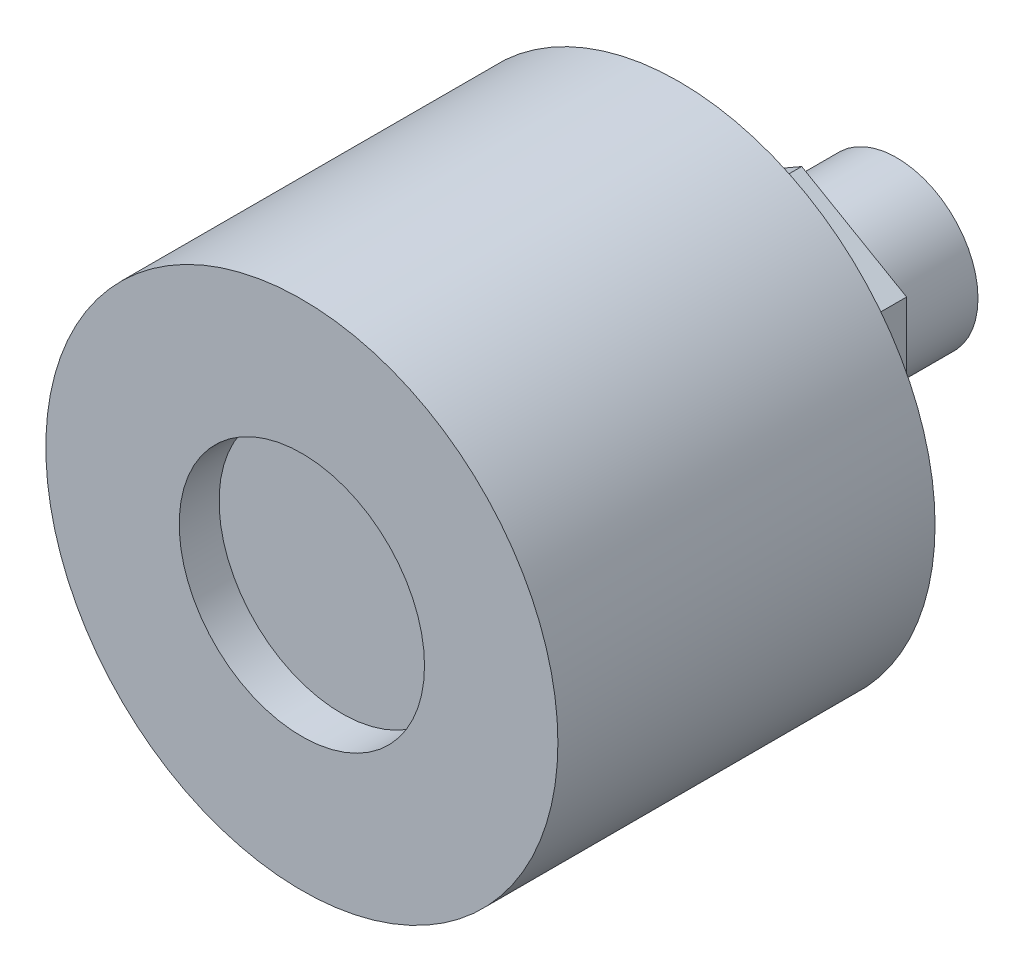
ISO-10303-21;
HEADER;
FILE_DESCRIPTION(('STEP AP214'),'2;1');
FILE_NAME('part.step','',(''),(''),'','','');
FILE_SCHEMA(('AUTOMOTIVE_DESIGN { 1 0 10303 214 1 1 1 1 }'));
ENDSEC;
DATA;
#1=APPLICATION_CONTEXT('core data for automotive mechanical design processes');
#2=APPLICATION_PROTOCOL_DEFINITION('international standard','automotive_design',2000,#1);
#3=PRODUCT_CONTEXT('',#1,'mechanical');
#4=PRODUCT('Part','Part','',(#3));
#5=PRODUCT_RELATED_PRODUCT_CATEGORY('part','',(#4));
#6=PRODUCT_DEFINITION_FORMATION('','',#4);
#7=PRODUCT_DEFINITION_CONTEXT('part definition',#1,'design');
#8=PRODUCT_DEFINITION('design','',#6,#7);
#9=PRODUCT_DEFINITION_SHAPE('','',#8);
#10=(LENGTH_UNIT() NAMED_UNIT(*) SI_UNIT(.MILLI.,.METRE.));
#11=(NAMED_UNIT(*) PLANE_ANGLE_UNIT() SI_UNIT($,.RADIAN.));
#12=(NAMED_UNIT(*) SI_UNIT($,.STERADIAN.) SOLID_ANGLE_UNIT());
#13=UNCERTAINTY_MEASURE_WITH_UNIT(LENGTH_MEASURE(1.E-05),#10,'distance_accuracy_value','');
#14=(GEOMETRIC_REPRESENTATION_CONTEXT(3) GLOBAL_UNCERTAINTY_ASSIGNED_CONTEXT((#13)) GLOBAL_UNIT_ASSIGNED_CONTEXT((#10,
#11,#12)) REPRESENTATION_CONTEXT('',''));
#15=CARTESIAN_POINT('',(0.,0.,0.));
#16=DIRECTION('',(0.,0.,1.));
#17=DIRECTION('',(1.,0.,0.));
#18=AXIS2_PLACEMENT_3D('',#15,#16,#17);
#19=CARTESIAN_POINT('',(0.,0.,-0.3));
#20=DIRECTION('',(0.,0.,1.));
#21=DIRECTION('',(1.,0.,0.));
#22=AXIS2_PLACEMENT_3D('',#19,#20,#21);
#23=CYLINDRICAL_SURFACE('',#22,8.35);
#24=CARTESIAN_POINT('',(0.,0.,1.));
#25=DIRECTION('',(0.,0.,1.));
#26=DIRECTION('',(1.,0.,0.));
#27=AXIS2_PLACEMENT_3D('',#24,#25,#26);
#28=CIRCLE('',#27,8.35);
#29=CARTESIAN_POINT('',(8.35,0.,1.));
#30=VERTEX_POINT('',#29);
#31=EDGE_CURVE('E129',#30,#30,#28,.T.);
#32=ORIENTED_EDGE('',*,*,#31,.F.);
#33=EDGE_LOOP('',(#32));
#34=FACE_BOUND('',#33,.T.);
#35=CARTESIAN_POINT('',(0.,0.,-11.3));
#36=DIRECTION('',(0.,0.,-1.));
#37=DIRECTION('',(-1.,0.,0.));
#38=AXIS2_PLACEMENT_3D('',#35,#36,#37);
#39=CIRCLE('',#38,8.35);
#40=CARTESIAN_POINT('',(-8.35,0.,-11.3));
#41=VERTEX_POINT('',#40);
#42=EDGE_CURVE('E116',#41,#41,#39,.T.);
#43=ORIENTED_EDGE('',*,*,#42,.F.);
#44=EDGE_LOOP('',(#43));
#45=FACE_BOUND('',#44,.T.);
#46=ADVANCED_FACE('F39',(#34,#45),#23,.T.);
#47=CARTESIAN_POINT('',(0.,0.,-0.3));
#48=DIRECTION('',(0.,0.,1.));
#49=DIRECTION('',(1.,0.,0.));
#50=AXIS2_PLACEMENT_3D('',#47,#48,#49);
#51=CYLINDRICAL_SURFACE('',#50,4.);
#52=CARTESIAN_POINT('',(0.,0.,-0.3));
#53=DIRECTION('',(0.,0.,1.));
#54=DIRECTION('',(1.,0.,0.));
#55=AXIS2_PLACEMENT_3D('',#52,#53,#54);
#56=CIRCLE('',#55,4.);
#57=CARTESIAN_POINT('',(4.,0.,-0.3));
#58=VERTEX_POINT('',#57);
#59=EDGE_CURVE('E42',#58,#58,#56,.T.);
#60=ORIENTED_EDGE('',*,*,#59,.F.);
#61=EDGE_LOOP('',(#60));
#62=FACE_BOUND('',#61,.T.);
#63=CARTESIAN_POINT('',(0.,0.,1.));
#64=DIRECTION('',(0.,0.,1.));
#65=DIRECTION('',(1.,0.,0.));
#66=AXIS2_PLACEMENT_3D('',#63,#64,#65);
#67=CIRCLE('',#66,4.);
#68=CARTESIAN_POINT('',(4.,0.,1.));
#69=VERTEX_POINT('',#68);
#70=EDGE_CURVE('E121',#69,#69,#67,.T.);
#71=ORIENTED_EDGE('',*,*,#70,.T.);
#72=EDGE_LOOP('',(#71));
#73=FACE_BOUND('',#72,.T.);
#74=ADVANCED_FACE('F140',(#62,#73),#51,.F.);
#75=CARTESIAN_POINT('',(0.,0.,1.));
#76=DIRECTION('',(0.,0.,1.));
#77=DIRECTION('',(1.,0.,0.));
#78=AXIS2_PLACEMENT_3D('',#75,#76,#77);
#79=PLANE('',#78);
#80=ORIENTED_EDGE('',*,*,#31,.T.);
#81=EDGE_LOOP('',(#80));
#82=FACE_BOUND('',#81,.T.);
#83=ORIENTED_EDGE('',*,*,#70,.F.);
#84=EDGE_LOOP('',(#83));
#85=FACE_BOUND('',#84,.T.);
#86=ADVANCED_FACE('F143',(#82,#85),#79,.T.);
#87=CARTESIAN_POINT('',(0.,0.,-0.3));
#88=DIRECTION('',(0.,0.,-1.));
#89=DIRECTION('',(-1.,0.,0.));
#90=AXIS2_PLACEMENT_3D('',#87,#88,#89);
#91=PLANE('',#90);
#92=ORIENTED_EDGE('',*,*,#59,.T.);
#93=EDGE_LOOP('',(#92));
#94=FACE_BOUND('',#93,.T.);
#95=ADVANCED_FACE('F138',(#94),#91,.F.);
#96=CARTESIAN_POINT('',(0.,0.,-11.3));
#97=DIRECTION('',(0.,0.,-1.));
#98=DIRECTION('',(-1.,0.,0.));
#99=AXIS2_PLACEMENT_3D('',#96,#97,#98);
#100=PLANE('',#99);
#101=DIRECTION('',(0.866025403784442,0.499999999999995,0.));
#102=VECTOR('',#101,1.);
#103=CARTESIAN_POINT('',(-3.42080034494851,1.97500000000004,-11.3));
#104=LINE('',#103,#102);
#105=CARTESIAN_POINT('',(-3.42080034494851,1.97500000000004,-11.3));
#106=VERTEX_POINT('',#105);
#107=CARTESIAN_POINT('',(0.,3.95,-11.3));
#108=VERTEX_POINT('',#107);
#109=EDGE_CURVE('E55',#106,#108,#104,.T.);
#110=ORIENTED_EDGE('',*,*,#109,.F.);
#111=DIRECTION('',(0.,1.,0.));
#112=VECTOR('',#111,1.);
#113=CARTESIAN_POINT('',(-3.42080034494855,-1.97499999999997,-11.3));
#114=LINE('',#113,#112);
#115=CARTESIAN_POINT('',(-3.42080034494855,-1.97499999999997,-11.3));
#116=VERTEX_POINT('',#115);
#117=EDGE_CURVE('E59',#116,#106,#114,.T.);
#118=ORIENTED_EDGE('',*,*,#117,.F.);
#119=DIRECTION('',(-0.866025403784436,0.500000000000004,0.));
#120=VECTOR('',#119,1.);
#121=CARTESIAN_POINT('',(0.,-3.95,-11.3));
#122=LINE('',#121,#120);
#123=CARTESIAN_POINT('',(0.,-3.95,-11.3));
#124=VERTEX_POINT('',#123);
#125=EDGE_CURVE('E243',#124,#116,#122,.T.);
#126=ORIENTED_EDGE('',*,*,#125,.F.);
#127=DIRECTION('',(-0.86602540378444,-0.499999999999998,0.));
#128=VECTOR('',#127,1.);
#129=CARTESIAN_POINT('',(3.42080034494852,-1.97500000000002,-11.3));
#130=LINE('',#129,#128);
#131=CARTESIAN_POINT('',(3.42080034494852,-1.97500000000002,-11.3));
#132=VERTEX_POINT('',#131);
#133=EDGE_CURVE('E239',#132,#124,#130,.T.);
#134=ORIENTED_EDGE('',*,*,#133,.F.);
#135=DIRECTION('',(0.,-1.,0.));
#136=VECTOR('',#135,1.);
#137=CARTESIAN_POINT('',(3.42080034494854,1.97499999999999,-11.3));
#138=LINE('',#137,#136);
#139=CARTESIAN_POINT('',(3.42080034494854,1.97499999999999,-11.3));
#140=VERTEX_POINT('',#139);
#141=EDGE_CURVE('E235',#140,#132,#138,.T.);
#142=ORIENTED_EDGE('',*,*,#141,.F.);
#143=DIRECTION('',(0.866025403784438,-0.500000000000001,0.));
#144=VECTOR('',#143,1.);
#145=CARTESIAN_POINT('',(0.,3.95,-11.3));
#146=LINE('',#145,#144);
#147=EDGE_CURVE('E232',#108,#140,#146,.T.);
#148=ORIENTED_EDGE('',*,*,#147,.F.);
#149=EDGE_LOOP('',(#110,#118,#126,#134,#142,#148));
#150=FACE_BOUND('',#149,.T.);
#151=ORIENTED_EDGE('',*,*,#42,.T.);
#152=EDGE_LOOP('',(#151));
#153=FACE_BOUND('',#152,.T.);
#154=ADVANCED_FACE('F151',(#150,#153),#100,.T.);
#155=CARTESIAN_POINT('',(-3.42080034494851,1.97500000000004,-15.3));
#156=DIRECTION('',(0.499999999999995,-0.866025403784442,0.));
#157=DIRECTION('',(0.866025403784442,0.499999999999995,0.));
#158=AXIS2_PLACEMENT_3D('',#155,#156,#157);
#159=PLANE('',#158);
#160=ORIENTED_EDGE('',*,*,#109,.T.);
#161=DIRECTION('',(0.,0.,1.));
#162=VECTOR('',#161,1.);
#163=CARTESIAN_POINT('',(0.,3.95,-15.3));
#164=LINE('',#163,#162);
#165=CARTESIAN_POINT('',(0.,3.95,-15.3));
#166=VERTEX_POINT('',#165);
#167=EDGE_CURVE('E96',#166,#108,#164,.T.);
#168=ORIENTED_EDGE('',*,*,#167,.F.);
#169=DIRECTION('',(0.866025403784442,0.499999999999995,0.));
#170=VECTOR('',#169,1.);
#171=CARTESIAN_POINT('',(-3.42080034494851,1.97500000000004,-15.3));
#172=LINE('',#171,#170);
#173=CARTESIAN_POINT('',(-3.42080034494851,1.97500000000004,-15.3));
#174=VERTEX_POINT('',#173);
#175=EDGE_CURVE('E103',#174,#166,#172,.T.);
#176=ORIENTED_EDGE('',*,*,#175,.F.);
#177=DIRECTION('',(0.,0.,1.));
#178=VECTOR('',#177,1.);
#179=CARTESIAN_POINT('',(-3.42080034494851,1.97500000000004,-15.3));
#180=LINE('',#179,#178);
#181=EDGE_CURVE('E229',#174,#106,#180,.T.);
#182=ORIENTED_EDGE('',*,*,#181,.T.);
#183=EDGE_LOOP('',(#160,#168,#176,#182));
#184=FACE_BOUND('',#183,.T.);
#185=ADVANCED_FACE('F114',(#184),#159,.F.);
#186=CARTESIAN_POINT('',(0.,3.95,-15.3));
#187=DIRECTION('',(-0.500000000000001,-0.866025403784438,0.));
#188=DIRECTION('',(0.866025403784438,-0.500000000000001,0.));
#189=AXIS2_PLACEMENT_3D('',#186,#187,#188);
#190=PLANE('',#189);
#191=ORIENTED_EDGE('',*,*,#147,.T.);
#192=DIRECTION('',(0.,0.,1.));
#193=VECTOR('',#192,1.);
#194=CARTESIAN_POINT('',(3.42080034494854,1.97499999999999,-15.3));
#195=LINE('',#194,#193);
#196=CARTESIAN_POINT('',(3.42080034494854,1.97499999999999,-15.3));
#197=VERTEX_POINT('',#196);
#198=EDGE_CURVE('E98',#197,#140,#195,.T.);
#199=ORIENTED_EDGE('',*,*,#198,.F.);
#200=DIRECTION('',(0.866025403784438,-0.500000000000001,0.));
#201=VECTOR('',#200,1.);
#202=CARTESIAN_POINT('',(0.,3.95,-15.3));
#203=LINE('',#202,#201);
#204=EDGE_CURVE('E91',#166,#197,#203,.T.);
#205=ORIENTED_EDGE('',*,*,#204,.F.);
#206=ORIENTED_EDGE('',*,*,#167,.T.);
#207=EDGE_LOOP('',(#191,#199,#205,#206));
#208=FACE_BOUND('',#207,.T.);
#209=ADVANCED_FACE('F94',(#208),#190,.F.);
#210=CARTESIAN_POINT('',(3.42080034494854,1.97499999999999,-15.3));
#211=DIRECTION('',(-1.,0.,0.));
#212=DIRECTION('',(0.,-1.,0.));
#213=AXIS2_PLACEMENT_3D('',#210,#211,#212);
#214=PLANE('',#213);
#215=ORIENTED_EDGE('',*,*,#141,.T.);
#216=DIRECTION('',(0.,0.,1.));
#217=VECTOR('',#216,1.);
#218=CARTESIAN_POINT('',(3.42080034494852,-1.97500000000002,-15.3));
#219=LINE('',#218,#217);
#220=CARTESIAN_POINT('',(3.42080034494852,-1.97500000000002,-15.3));
#221=VERTEX_POINT('',#220);
#222=EDGE_CURVE('E123',#221,#132,#219,.T.);
#223=ORIENTED_EDGE('',*,*,#222,.F.);
#224=DIRECTION('',(0.,-1.,0.));
#225=VECTOR('',#224,1.);
#226=CARTESIAN_POINT('',(3.42080034494854,1.97499999999999,-15.3));
#227=LINE('',#226,#225);
#228=EDGE_CURVE('E102',#197,#221,#227,.T.);
#229=ORIENTED_EDGE('',*,*,#228,.F.);
#230=ORIENTED_EDGE('',*,*,#198,.T.);
#231=EDGE_LOOP('',(#215,#223,#229,#230));
#232=FACE_BOUND('',#231,.T.);
#233=ADVANCED_FACE('F169',(#232),#214,.F.);
#234=CARTESIAN_POINT('',(3.42080034494852,-1.97500000000002,-15.3));
#235=DIRECTION('',(-0.499999999999998,0.86602540378444,0.));
#236=DIRECTION('',(-0.86602540378444,-0.499999999999998,0.));
#237=AXIS2_PLACEMENT_3D('',#234,#235,#236);
#238=PLANE('',#237);
#239=ORIENTED_EDGE('',*,*,#133,.T.);
#240=DIRECTION('',(0.,0.,1.));
#241=VECTOR('',#240,1.);
#242=CARTESIAN_POINT('',(0.,-3.95,-15.3));
#243=LINE('',#242,#241);
#244=CARTESIAN_POINT('',(0.,-3.95,-15.3));
#245=VERTEX_POINT('',#244);
#246=EDGE_CURVE('E254',#245,#124,#243,.T.);
#247=ORIENTED_EDGE('',*,*,#246,.F.);
#248=DIRECTION('',(-0.86602540378444,-0.499999999999998,0.));
#249=VECTOR('',#248,1.);
#250=CARTESIAN_POINT('',(3.42080034494852,-1.97500000000002,-15.3));
#251=LINE('',#250,#249);
#252=EDGE_CURVE('E221',#221,#245,#251,.T.);
#253=ORIENTED_EDGE('',*,*,#252,.F.);
#254=ORIENTED_EDGE('',*,*,#222,.T.);
#255=EDGE_LOOP('',(#239,#247,#253,#254));
#256=FACE_BOUND('',#255,.T.);
#257=ADVANCED_FACE('F172',(#256),#238,.F.);
#258=CARTESIAN_POINT('',(0.,-3.95,-15.3));
#259=DIRECTION('',(0.500000000000004,0.866025403784436,0.));
#260=DIRECTION('',(-0.866025403784436,0.500000000000004,0.));
#261=AXIS2_PLACEMENT_3D('',#258,#259,#260);
#262=PLANE('',#261);
#263=ORIENTED_EDGE('',*,*,#125,.T.);
#264=DIRECTION('',(0.,0.,1.));
#265=VECTOR('',#264,1.);
#266=CARTESIAN_POINT('',(-3.42080034494855,-1.97499999999997,-15.3));
#267=LINE('',#266,#265);
#268=CARTESIAN_POINT('',(-3.42080034494855,-1.97499999999997,-15.3));
#269=VERTEX_POINT('',#268);
#270=EDGE_CURVE('E250',#269,#116,#267,.T.);
#271=ORIENTED_EDGE('',*,*,#270,.F.);
#272=DIRECTION('',(-0.866025403784436,0.500000000000004,0.));
#273=VECTOR('',#272,1.);
#274=CARTESIAN_POINT('',(0.,-3.95,-15.3));
#275=LINE('',#274,#273);
#276=EDGE_CURVE('E224',#245,#269,#275,.T.);
#277=ORIENTED_EDGE('',*,*,#276,.F.);
#278=ORIENTED_EDGE('',*,*,#246,.T.);
#279=EDGE_LOOP('',(#263,#271,#277,#278));
#280=FACE_BOUND('',#279,.T.);
#281=ADVANCED_FACE('F176',(#280),#262,.F.);
#282=CARTESIAN_POINT('',(-3.42080034494855,-1.97499999999997,-15.3));
#283=DIRECTION('',(1.,0.,0.));
#284=DIRECTION('',(0.,1.,0.));
#285=AXIS2_PLACEMENT_3D('',#282,#283,#284);
#286=PLANE('',#285);
#287=ORIENTED_EDGE('',*,*,#117,.T.);
#288=ORIENTED_EDGE('',*,*,#181,.F.);
#289=DIRECTION('',(0.,1.,0.));
#290=VECTOR('',#289,1.);
#291=CARTESIAN_POINT('',(-3.42080034494855,-1.97499999999997,-15.3));
#292=LINE('',#291,#290);
#293=EDGE_CURVE('E108',#269,#174,#292,.T.);
#294=ORIENTED_EDGE('',*,*,#293,.F.);
#295=ORIENTED_EDGE('',*,*,#270,.T.);
#296=EDGE_LOOP('',(#287,#288,#294,#295));
#297=FACE_BOUND('',#296,.T.);
#298=ADVANCED_FACE('F180',(#297),#286,.F.);
#299=CARTESIAN_POINT('',(0.,0.,-15.3));
#300=DIRECTION('',(0.,0.,-1.));
#301=DIRECTION('',(-1.,0.,0.));
#302=AXIS2_PLACEMENT_3D('',#299,#300,#301);
#303=PLANE('',#302);
#304=CARTESIAN_POINT('',(0.,0.,-15.3));
#305=DIRECTION('',(0.,0.,-1.));
#306=DIRECTION('',(-1.,0.,0.));
#307=AXIS2_PLACEMENT_3D('',#304,#305,#306);
#308=CIRCLE('',#307,2.65);
#309=CARTESIAN_POINT('',(2.65,0.,-15.3));
#310=VERTEX_POINT('',#309);
#311=EDGE_CURVE('E11',#310,#310,#308,.T.);
#312=ORIENTED_EDGE('',*,*,#311,.F.);
#313=EDGE_LOOP('',(#312));
#314=FACE_BOUND('',#313,.T.);
#315=ORIENTED_EDGE('',*,*,#175,.T.);
#316=ORIENTED_EDGE('',*,*,#204,.T.);
#317=ORIENTED_EDGE('',*,*,#228,.T.);
#318=ORIENTED_EDGE('',*,*,#252,.T.);
#319=ORIENTED_EDGE('',*,*,#276,.T.);
#320=ORIENTED_EDGE('',*,*,#293,.T.);
#321=EDGE_LOOP('',(#315,#316,#317,#318,#319,#320));
#322=FACE_BOUND('',#321,.T.);
#323=ADVANCED_FACE('F106',(#314,#322),#303,.T.);
#324=CARTESIAN_POINT('',(0.,0.,-18.4));
#325=DIRECTION('',(0.,0.,1.));
#326=DIRECTION('',(1.,0.,0.));
#327=AXIS2_PLACEMENT_3D('',#324,#325,#326);
#328=CYLINDRICAL_SURFACE('',#327,2.65);
#329=CARTESIAN_POINT('',(0.,0.,-18.4));
#330=DIRECTION('',(0.,0.,-1.));
#331=DIRECTION('',(-1.,0.,0.));
#332=AXIS2_PLACEMENT_3D('',#329,#330,#331);
#333=CIRCLE('',#332,2.65);
#334=CARTESIAN_POINT('',(2.65,0.,-18.4));
#335=VERTEX_POINT('',#334);
#336=EDGE_CURVE('E209',#335,#335,#333,.T.);
#337=CARTESIAN_POINT('',(2.65,0.,-18.4));
#338=CARTESIAN_POINT('',(2.65,0.,-18.3677083333333));
#339=CARTESIAN_POINT('',(2.65,0.,-18.3354166666667));
#340=CARTESIAN_POINT('',(2.65,0.,-18.2708333333333));
#341=CARTESIAN_POINT('',(2.65,0.,-18.2385416666667));
#342=CARTESIAN_POINT('',(2.65,0.,-18.1739583333333));
#343=CARTESIAN_POINT('',(2.65,0.,-18.1416666666667));
#344=CARTESIAN_POINT('',(2.65,0.,-18.0770833333333));
#345=CARTESIAN_POINT('',(2.65,0.,-18.0447916666667));
#346=CARTESIAN_POINT('',(2.65,0.,-17.9802083333333));
#347=CARTESIAN_POINT('',(2.65,0.,-17.9479166666667));
#348=CARTESIAN_POINT('',(2.65,0.,-17.8833333333333));
#349=CARTESIAN_POINT('',(2.65,0.,-17.8510416666667));
#350=CARTESIAN_POINT('',(2.65,0.,-17.7864583333333));
#351=CARTESIAN_POINT('',(2.65,0.,-17.7541666666667));
#352=CARTESIAN_POINT('',(2.65,0.,-17.6895833333333));
#353=CARTESIAN_POINT('',(2.65,0.,-17.6572916666667));
#354=CARTESIAN_POINT('',(2.65,0.,-17.5927083333333));
#355=CARTESIAN_POINT('',(2.65,0.,-17.5604166666667));
#356=CARTESIAN_POINT('',(2.65,0.,-17.4958333333333));
#357=CARTESIAN_POINT('',(2.65,0.,-17.4635416666667));
#358=CARTESIAN_POINT('',(2.65,0.,-17.3989583333333));
#359=CARTESIAN_POINT('',(2.65,0.,-17.3666666666667));
#360=CARTESIAN_POINT('',(2.65,0.,-17.3020833333333));
#361=CARTESIAN_POINT('',(2.65,0.,-17.2697916666667));
#362=CARTESIAN_POINT('',(2.65,0.,-17.2052083333333));
#363=CARTESIAN_POINT('',(2.65,0.,-17.1729166666667));
#364=CARTESIAN_POINT('',(2.65,0.,-17.1083333333333));
#365=CARTESIAN_POINT('',(2.65,0.,-17.0760416666667));
#366=CARTESIAN_POINT('',(2.65,0.,-17.0114583333333));
#367=CARTESIAN_POINT('',(2.65,0.,-16.9791666666667));
#368=CARTESIAN_POINT('',(2.65,0.,-16.9145833333333));
#369=CARTESIAN_POINT('',(2.65,0.,-16.8822916666667));
#370=CARTESIAN_POINT('',(2.65,0.,-16.8177083333333));
#371=CARTESIAN_POINT('',(2.65,0.,-16.7854166666667));
#372=CARTESIAN_POINT('',(2.65,0.,-16.7208333333333));
#373=CARTESIAN_POINT('',(2.65,0.,-16.6885416666667));
#374=CARTESIAN_POINT('',(2.65,0.,-16.6239583333333));
#375=CARTESIAN_POINT('',(2.65,0.,-16.5916666666667));
#376=CARTESIAN_POINT('',(2.65,0.,-16.5270833333333));
#377=CARTESIAN_POINT('',(2.65,0.,-16.4947916666667));
#378=CARTESIAN_POINT('',(2.65,0.,-16.4302083333333));
#379=CARTESIAN_POINT('',(2.65,0.,-16.3979166666667));
#380=CARTESIAN_POINT('',(2.65,0.,-16.3333333333333));
#381=CARTESIAN_POINT('',(2.65,0.,-16.3010416666667));
#382=CARTESIAN_POINT('',(2.65,0.,-16.2364583333333));
#383=CARTESIAN_POINT('',(2.65,0.,-16.2041666666667));
#384=CARTESIAN_POINT('',(2.65,0.,-16.1395833333333));
#385=CARTESIAN_POINT('',(2.65,0.,-16.1072916666667));
#386=CARTESIAN_POINT('',(2.65,0.,-16.0427083333333));
#387=CARTESIAN_POINT('',(2.65,0.,-16.0104166666667));
#388=CARTESIAN_POINT('',(2.65,0.,-15.9458333333333));
#389=CARTESIAN_POINT('',(2.65,0.,-15.9135416666667));
#390=CARTESIAN_POINT('',(2.65,0.,-15.8489583333333));
#391=CARTESIAN_POINT('',(2.65,0.,-15.8166666666667));
#392=CARTESIAN_POINT('',(2.65,0.,-15.7520833333333));
#393=CARTESIAN_POINT('',(2.65,0.,-15.7197916666667));
#394=CARTESIAN_POINT('',(2.65,0.,-15.6552083333333));
#395=CARTESIAN_POINT('',(2.65,0.,-15.6229166666667));
#396=CARTESIAN_POINT('',(2.65,0.,-15.5583333333333));
#397=CARTESIAN_POINT('',(2.65,0.,-15.5260416666667));
#398=CARTESIAN_POINT('',(2.65,0.,-15.4614583333333));
#399=CARTESIAN_POINT('',(2.65,0.,-15.4291666666667));
#400=CARTESIAN_POINT('',(2.65,0.,-15.3645833333333));
#401=CARTESIAN_POINT('',(2.65,0.,-15.3322916666667));
#402=CARTESIAN_POINT('',(2.65,0.,-15.3));
#403=B_SPLINE_CURVE_WITH_KNOTS('',3,(#337,#338,#339,#340,#341,#342,#343,#344,#345,#346,#347,
#348,#349,#350,#351,#352,#353,#354,#355,#356,#357,#358,#359,#360,#361,#362,#363,#364,#365,#366,
#367,#368,#369,#370,#371,#372,#373,#374,#375,#376,#377,#378,#379,#380,#381,#382,#383,#384,#385,
#386,#387,#388,#389,#390,#391,#392,#393,#394,#395,#396,#397,#398,#399,#400,#401,#402),
.UNSPECIFIED.,.F.,.F.,(4,2,2,2,2,2,2,2,2,2,2,2,2,2,2,2,2,2,2,2,2,2,2,2,2,2,2,2,2,2,2,2,4),(0.,
0.0968749999999997,0.193749999999999,0.290624999999999,0.387499999999999,0.484374999999999,
0.581249999999998,0.678124999999998,0.774999999999998,0.871874999999998,0.968749999999997,
1.065625,1.1625,1.259375,1.35625,1.453125,1.55,1.646875,1.74375,1.840625,1.9375,2.034375,
2.13125,2.228125,2.325,2.421875,2.51875,2.615625,2.7125,2.809375,2.90625,3.003125,3.1),.UNSPECIFIED.);
#404=EDGE_CURVE('BSEAM187',#335,#310,#403,.T.);
#405=ORIENTED_EDGE('',*,*,#336,.F.);
#406=ORIENTED_EDGE('',*,*,#311,.T.);
#407=ORIENTED_EDGE('',*,*,#404,.T.);
#408=ORIENTED_EDGE('',*,*,#404,.F.);
#409=EDGE_LOOP('',(#405,#407,#406,#408));
#410=FACE_BOUND('',#409,.T.);
#411=ADVANCED_FACE('F187',(#410),#328,.T.);
#412=CARTESIAN_POINT('',(0.,0.,-18.4));
#413=DIRECTION('',(0.,0.,-1.));
#414=DIRECTION('',(-1.,0.,0.));
#415=AXIS2_PLACEMENT_3D('',#412,#413,#414);
#416=PLANE('',#415);
#417=CARTESIAN_POINT('',(0.,0.,-18.4));
#418=DIRECTION('',(0.,0.,-1.));
#419=DIRECTION('',(-1.,0.,0.));
#420=AXIS2_PLACEMENT_3D('',#417,#418,#419);
#421=CIRCLE('',#420,0.244312337230213);
#422=CARTESIAN_POINT('',(-0.244312337230213,0.,-18.4));
#423=VERTEX_POINT('',#422);
#424=EDGE_CURVE('E210',#423,#423,#421,.T.);
#425=ORIENTED_EDGE('',*,*,#424,.F.);
#426=EDGE_LOOP('',(#425));
#427=FACE_BOUND('',#426,.T.);
#428=ORIENTED_EDGE('',*,*,#336,.T.);
#429=EDGE_LOOP('',(#428));
#430=FACE_BOUND('',#429,.T.);
#431=ADVANCED_FACE('F191',(#427,#430),#416,.T.);
#432=CARTESIAN_POINT('',(0.,0.,-16.4));
#433=DIRECTION('',(0.,0.,-1.));
#434=DIRECTION('',(-1.,0.,0.));
#435=AXIS2_PLACEMENT_3D('',#432,#433,#434);
#436=CYLINDRICAL_SURFACE('',#435,0.244312337230213);
#437=CARTESIAN_POINT('',(0.,0.,-16.4));
#438=DIRECTION('',(0.,0.,-1.));
#439=DIRECTION('',(-1.,0.,0.));
#440=AXIS2_PLACEMENT_3D('',#437,#438,#439);
#441=CIRCLE('',#440,0.244312337230213);
#442=CARTESIAN_POINT('',(-0.244312337230213,0.,-16.4));
#443=VERTEX_POINT('',#442);
#444=EDGE_CURVE('E207',#443,#443,#441,.T.);
#445=ORIENTED_EDGE('',*,*,#444,.F.);
#446=EDGE_LOOP('',(#445));
#447=FACE_BOUND('',#446,.T.);
#448=ORIENTED_EDGE('',*,*,#424,.T.);
#449=EDGE_LOOP('',(#448));
#450=FACE_BOUND('',#449,.T.);
#451=ADVANCED_FACE('F195',(#447,#450),#436,.F.);
#452=CARTESIAN_POINT('',(0.,0.,-16.4));
#453=DIRECTION('',(0.,0.,-1.));
#454=DIRECTION('',(-1.,0.,0.));
#455=AXIS2_PLACEMENT_3D('',#452,#453,#454);
#456=PLANE('',#455);
#457=ORIENTED_EDGE('',*,*,#444,.T.);
#458=EDGE_LOOP('',(#457));
#459=FACE_BOUND('',#458,.T.);
#460=ADVANCED_FACE('F199',(#459),#456,.T.);
#461=CLOSED_SHELL('',(#46,#74,#86,#95,#154,#185,#209,#233,#257,#281,#298,#323,#411,#431,#451,#460));
#462=MANIFOLD_SOLID_BREP('B2',#461);
#463=ADVANCED_BREP_SHAPE_REPRESENTATION('',(#18,#462),#14);
#464=SHAPE_DEFINITION_REPRESENTATION(#9,#463);
ENDSEC;
END-ISO-10303-21;
